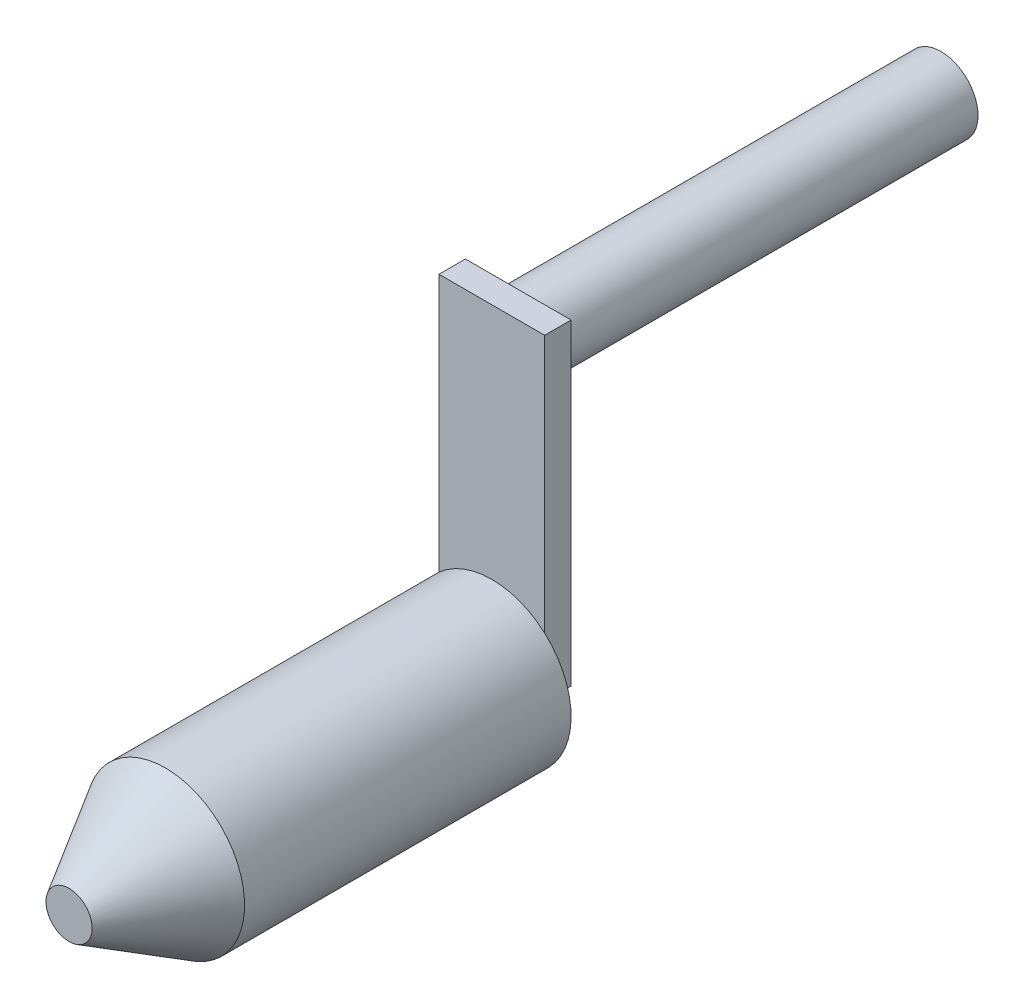
ISO-10303-21;
HEADER;
FILE_DESCRIPTION(('STEP AP214'),'2;1');
FILE_NAME('part.step','',(''),(''),'','','');
FILE_SCHEMA(('AUTOMOTIVE_DESIGN { 1 0 10303 214 1 1 1 1 }'));
ENDSEC;
DATA;
#1=APPLICATION_CONTEXT('core data for automotive mechanical design processes');
#2=APPLICATION_PROTOCOL_DEFINITION('international standard','automotive_design',2000,#1);
#3=PRODUCT_CONTEXT('',#1,'mechanical');
#4=PRODUCT('Part','Part','',(#3));
#5=PRODUCT_RELATED_PRODUCT_CATEGORY('part','',(#4));
#6=PRODUCT_DEFINITION_FORMATION('','',#4);
#7=PRODUCT_DEFINITION_CONTEXT('part definition',#1,'design');
#8=PRODUCT_DEFINITION('design','',#6,#7);
#9=PRODUCT_DEFINITION_SHAPE('','',#8);
#10=(LENGTH_UNIT() NAMED_UNIT(*) SI_UNIT(.MILLI.,.METRE.));
#11=(NAMED_UNIT(*) PLANE_ANGLE_UNIT() SI_UNIT($,.RADIAN.));
#12=(NAMED_UNIT(*) SI_UNIT($,.STERADIAN.) SOLID_ANGLE_UNIT());
#13=UNCERTAINTY_MEASURE_WITH_UNIT(LENGTH_MEASURE(1.E-05),#10,'distance_accuracy_value','');
#14=(GEOMETRIC_REPRESENTATION_CONTEXT(3) GLOBAL_UNCERTAINTY_ASSIGNED_CONTEXT((#13)) GLOBAL_UNIT_ASSIGNED_CONTEXT((#10,
#11,#12)) REPRESENTATION_CONTEXT('',''));
#15=CARTESIAN_POINT('',(0.,0.,0.));
#16=DIRECTION('',(0.,0.,1.));
#17=DIRECTION('',(1.,0.,0.));
#18=AXIS2_PLACEMENT_3D('',#15,#16,#17);
#19=CARTESIAN_POINT('',(0.,0.,0.));
#20=DIRECTION('',(0.,0.,1.));
#21=DIRECTION('',(1.,0.,0.));
#22=AXIS2_PLACEMENT_3D('',#19,#20,#21);
#23=PLANE('',#22);
#24=DIRECTION('',(0.,1.,0.));
#25=VECTOR('',#24,1.);
#26=CARTESIAN_POINT('',(-6.35,0.,0.));
#27=LINE('',#26,#25);
#28=CARTESIAN_POINT('',(-6.35,0.,0.));
#29=VERTEX_POINT('',#28);
#30=CARTESIAN_POINT('',(-6.35,7.09951582856183,0.));
#31=VERTEX_POINT('',#30);
#32=EDGE_CURVE('E49',#29,#31,#27,.T.);
#33=ORIENTED_EDGE('',*,*,#32,.F.);
#34=DIRECTION('',(-1.,0.,0.));
#35=VECTOR('',#34,1.);
#36=CARTESIAN_POINT('',(6.35,0.,0.));
#37=LINE('',#36,#35);
#38=CARTESIAN_POINT('',(6.35,0.,0.));
#39=VERTEX_POINT('',#38);
#40=EDGE_CURVE('E99',#39,#29,#37,.T.);
#41=ORIENTED_EDGE('',*,*,#40,.F.);
#42=DIRECTION('',(0.,-1.,0.));
#43=VECTOR('',#42,1.);
#44=CARTESIAN_POINT('',(6.35,0.,0.));
#45=LINE('',#44,#43);
#46=CARTESIAN_POINT('',(6.35,7.09951582856183,0.));
#47=VERTEX_POINT('',#46);
#48=EDGE_CURVE('E42',#47,#39,#45,.T.);
#49=ORIENTED_EDGE('',*,*,#48,.F.);
#50=CARTESIAN_POINT('',(0.,0.,0.));
#51=DIRECTION('',(0.,0.,1.));
#52=DIRECTION('',(1.,0.,0.));
#53=AXIS2_PLACEMENT_3D('',#50,#51,#52);
#54=CIRCLE('',#53,9.525);
#55=EDGE_CURVE('E54',#31,#47,#54,.T.);
#56=ORIENTED_EDGE('',*,*,#55,.F.);
#57=EDGE_LOOP('',(#33,#41,#49,#56));
#58=FACE_BOUND('',#57,.T.);
#59=ADVANCED_FACE('F34',(#58),#23,.F.);
#60=CARTESIAN_POINT('',(0.,0.,50.8));
#61=DIRECTION('',(0.,0.,-1.));
#62=DIRECTION('',(-1.,0.,0.));
#63=AXIS2_PLACEMENT_3D('',#60,#61,#62);
#64=CYLINDRICAL_SURFACE('',#63,9.525);
#65=CARTESIAN_POINT('',(0.,0.,39.2321334462176));
#66=DIRECTION('',(0.,0.,-1.));
#67=DIRECTION('',(-1.,0.,0.));
#68=AXIS2_PLACEMENT_3D('',#65,#66,#67);
#69=CIRCLE('',#68,9.525);
#70=CARTESIAN_POINT('',(-9.525,0.,39.2321334462176));
#71=VERTEX_POINT('',#70);
#72=EDGE_CURVE('E131',#71,#71,#69,.T.);
#73=ORIENTED_EDGE('',*,*,#72,.T.);
#74=EDGE_LOOP('',(#73));
#75=FACE_BOUND('',#74,.T.);
#76=EDGE_CURVE('E106',#47,#31,#54,.T.);
#77=ORIENTED_EDGE('',*,*,#76,.T.);
#78=ORIENTED_EDGE('',*,*,#55,.T.);
#79=EDGE_LOOP('',(#77,#78));
#80=FACE_BOUND('',#79,.T.);
#81=ADVANCED_FACE('F36',(#75,#80),#64,.T.);
#82=CARTESIAN_POINT('',(0.,0.,0.));
#83=DIRECTION('',(0.,0.,1.));
#84=DIRECTION('',(1.,0.,0.));
#85=AXIS2_PLACEMENT_3D('',#82,#83,#84);
#86=PLANE('',#85);
#87=ORIENTED_EDGE('',*,*,#76,.F.);
#88=CARTESIAN_POINT('',(6.35,38.1,0.));
#89=VERTEX_POINT('',#88);
#90=EDGE_CURVE('E114',#89,#47,#45,.T.);
#91=ORIENTED_EDGE('',*,*,#90,.F.);
#92=DIRECTION('',(1.,0.,0.));
#93=VECTOR('',#92,1.);
#94=CARTESIAN_POINT('',(6.35,38.1,0.));
#95=LINE('',#94,#93);
#96=CARTESIAN_POINT('',(-6.35,38.1,0.));
#97=VERTEX_POINT('',#96);
#98=EDGE_CURVE('E121',#97,#89,#95,.T.);
#99=ORIENTED_EDGE('',*,*,#98,.F.);
#100=EDGE_CURVE('E103',#31,#97,#27,.T.);
#101=ORIENTED_EDGE('',*,*,#100,.F.);
#102=EDGE_LOOP('',(#87,#91,#99,#101));
#103=FACE_BOUND('',#102,.T.);
#104=ADVANCED_FACE('F154',(#103),#86,.T.);
#105=CARTESIAN_POINT('',(-6.35,0.,-3.175));
#106=DIRECTION('',(1.,0.,0.));
#107=DIRECTION('',(0.,0.,-1.));
#108=AXIS2_PLACEMENT_3D('',#105,#106,#107);
#109=PLANE('',#108);
#110=ORIENTED_EDGE('',*,*,#32,.T.);
#111=ORIENTED_EDGE('',*,*,#100,.T.);
#112=DIRECTION('',(0.,0.,1.));
#113=VECTOR('',#112,1.);
#114=CARTESIAN_POINT('',(-6.35,38.1,-3.175));
#115=LINE('',#114,#113);
#116=CARTESIAN_POINT('',(-6.35,38.1,-3.175));
#117=VERTEX_POINT('',#116);
#118=EDGE_CURVE('E84',#117,#97,#115,.T.);
#119=ORIENTED_EDGE('',*,*,#118,.F.);
#120=DIRECTION('',(0.,1.,0.));
#121=VECTOR('',#120,1.);
#122=CARTESIAN_POINT('',(-6.35,0.,-3.175));
#123=LINE('',#122,#121);
#124=CARTESIAN_POINT('',(-6.35,0.,-3.175));
#125=VERTEX_POINT('',#124);
#126=EDGE_CURVE('E90',#125,#117,#123,.T.);
#127=ORIENTED_EDGE('',*,*,#126,.F.);
#128=DIRECTION('',(0.,0.,1.));
#129=VECTOR('',#128,1.);
#130=CARTESIAN_POINT('',(-6.35,0.,-3.175));
#131=LINE('',#130,#129);
#132=EDGE_CURVE('E126',#125,#29,#131,.T.);
#133=ORIENTED_EDGE('',*,*,#132,.T.);
#134=EDGE_LOOP('',(#110,#111,#119,#127,#133));
#135=FACE_BOUND('',#134,.T.);
#136=ADVANCED_FACE('F101',(#135),#109,.F.);
#137=CARTESIAN_POINT('',(6.35,38.1,-3.175));
#138=DIRECTION('',(0.,-1.,0.));
#139=DIRECTION('',(0.,0.,-1.));
#140=AXIS2_PLACEMENT_3D('',#137,#138,#139);
#141=PLANE('',#140);
#142=ORIENTED_EDGE('',*,*,#98,.T.);
#143=DIRECTION('',(0.,0.,1.));
#144=VECTOR('',#143,1.);
#145=CARTESIAN_POINT('',(6.35,38.1,-3.175));
#146=LINE('',#145,#144);
#147=CARTESIAN_POINT('',(6.35,38.1,-3.175));
#148=VERTEX_POINT('',#147);
#149=EDGE_CURVE('E86',#148,#89,#146,.T.);
#150=ORIENTED_EDGE('',*,*,#149,.F.);
#151=DIRECTION('',(1.,0.,0.));
#152=VECTOR('',#151,1.);
#153=CARTESIAN_POINT('',(6.35,38.1,-3.175));
#154=LINE('',#153,#152);
#155=EDGE_CURVE('E80',#117,#148,#154,.T.);
#156=ORIENTED_EDGE('',*,*,#155,.F.);
#157=ORIENTED_EDGE('',*,*,#118,.T.);
#158=EDGE_LOOP('',(#142,#150,#156,#157));
#159=FACE_BOUND('',#158,.T.);
#160=ADVANCED_FACE('F82',(#159),#141,.F.);
#161=CARTESIAN_POINT('',(6.35,0.,-3.175));
#162=DIRECTION('',(-1.,0.,0.));
#163=DIRECTION('',(0.,0.,1.));
#164=AXIS2_PLACEMENT_3D('',#161,#162,#163);
#165=PLANE('',#164);
#166=ORIENTED_EDGE('',*,*,#90,.T.);
#167=ORIENTED_EDGE('',*,*,#48,.T.);
#168=DIRECTION('',(0.,0.,1.));
#169=VECTOR('',#168,1.);
#170=CARTESIAN_POINT('',(6.35,0.,-3.175));
#171=LINE('',#170,#169);
#172=CARTESIAN_POINT('',(6.35,0.,-3.175));
#173=VERTEX_POINT('',#172);
#174=EDGE_CURVE('E107',#173,#39,#171,.T.);
#175=ORIENTED_EDGE('',*,*,#174,.F.);
#176=DIRECTION('',(0.,-1.,0.));
#177=VECTOR('',#176,1.);
#178=CARTESIAN_POINT('',(6.35,0.,-3.175));
#179=LINE('',#178,#177);
#180=EDGE_CURVE('E89',#148,#173,#179,.T.);
#181=ORIENTED_EDGE('',*,*,#180,.F.);
#182=ORIENTED_EDGE('',*,*,#149,.T.);
#183=EDGE_LOOP('',(#166,#167,#175,#181,#182));
#184=FACE_BOUND('',#183,.T.);
#185=ADVANCED_FACE('F171',(#184),#165,.F.);
#186=CARTESIAN_POINT('',(6.35,0.,-3.175));
#187=DIRECTION('',(0.,1.,0.));
#188=DIRECTION('',(0.,0.,1.));
#189=AXIS2_PLACEMENT_3D('',#186,#187,#188);
#190=PLANE('',#189);
#191=ORIENTED_EDGE('',*,*,#40,.T.);
#192=ORIENTED_EDGE('',*,*,#132,.F.);
#193=DIRECTION('',(-1.,0.,0.));
#194=VECTOR('',#193,1.);
#195=CARTESIAN_POINT('',(6.35,0.,-3.175));
#196=LINE('',#195,#194);
#197=EDGE_CURVE('E95',#173,#125,#196,.T.);
#198=ORIENTED_EDGE('',*,*,#197,.F.);
#199=ORIENTED_EDGE('',*,*,#174,.T.);
#200=EDGE_LOOP('',(#191,#192,#198,#199));
#201=FACE_BOUND('',#200,.T.);
#202=ADVANCED_FACE('F168',(#201),#190,.F.);
#203=CARTESIAN_POINT('',(0.,0.,-3.175));
#204=DIRECTION('',(0.,0.,1.));
#205=DIRECTION('',(1.,0.,0.));
#206=AXIS2_PLACEMENT_3D('',#203,#204,#205);
#207=PLANE('',#206);
#208=CARTESIAN_POINT('',(0.,33.02,-3.175));
#209=DIRECTION('',(0.,0.,1.));
#210=DIRECTION('',(1.,0.,0.));
#211=AXIS2_PLACEMENT_3D('',#208,#209,#210);
#212=CIRCLE('',#211,4.445);
#213=CARTESIAN_POINT('',(4.445,33.02,-3.175));
#214=VERTEX_POINT('',#213);
#215=EDGE_CURVE('E11',#214,#214,#212,.F.);
#216=ORIENTED_EDGE('',*,*,#215,.F.);
#217=EDGE_LOOP('',(#216));
#218=FACE_BOUND('',#217,.T.);
#219=ORIENTED_EDGE('',*,*,#126,.T.);
#220=ORIENTED_EDGE('',*,*,#155,.T.);
#221=ORIENTED_EDGE('',*,*,#180,.T.);
#222=ORIENTED_EDGE('',*,*,#197,.T.);
#223=EDGE_LOOP('',(#219,#220,#221,#222));
#224=FACE_BOUND('',#223,.T.);
#225=ADVANCED_FACE('F93',(#218,#224),#207,.F.);
#226=CARTESIAN_POINT('',(0.,33.02,-53.975));
#227=DIRECTION('',(0.,0.,1.));
#228=DIRECTION('',(1.,0.,0.));
#229=AXIS2_PLACEMENT_3D('',#226,#227,#228);
#230=CYLINDRICAL_SURFACE('',#229,4.445);
#231=CARTESIAN_POINT('',(0.,33.02,-53.975));
#232=DIRECTION('',(0.,0.,-1.));
#233=DIRECTION('',(-1.,0.,0.));
#234=AXIS2_PLACEMENT_3D('',#231,#232,#233);
#235=CIRCLE('',#234,4.445);
#236=CARTESIAN_POINT('',(-4.445,33.02,-53.975));
#237=VERTEX_POINT('',#236);
#238=EDGE_CURVE('E128',#237,#237,#235,.T.);
#239=ORIENTED_EDGE('',*,*,#238,.F.);
#240=EDGE_LOOP('',(#239));
#241=FACE_BOUND('',#240,.T.);
#242=ORIENTED_EDGE('',*,*,#215,.T.);
#243=EDGE_LOOP('',(#242));
#244=FACE_BOUND('',#243,.T.);
#245=ADVANCED_FACE('F194',(#241,#244),#230,.T.);
#246=CARTESIAN_POINT('',(0.,33.02,-53.975));
#247=DIRECTION('',(0.,0.,-1.));
#248=DIRECTION('',(-1.,0.,0.));
#249=AXIS2_PLACEMENT_3D('',#246,#247,#248);
#250=PLANE('',#249);
#251=ORIENTED_EDGE('',*,*,#238,.T.);
#252=EDGE_LOOP('',(#251));
#253=FACE_BOUND('',#252,.T.);
#254=ADVANCED_FACE('F146',(#253),#250,.T.);
#255=CARTESIAN_POINT('',(0.,0.,50.8));
#256=DIRECTION('',(0.,0.,-1.));
#257=DIRECTION('',(-1.,0.,0.));
#258=AXIS2_PLACEMENT_3D('',#255,#256,#257);
#259=CONICAL_SURFACE('',#258,2.77134642997771,0.528444038250657);
#260=CARTESIAN_POINT('',(0.,0.,50.8));
#261=DIRECTION('',(0.,0.,-1.));
#262=DIRECTION('',(-1.,0.,0.));
#263=AXIS2_PLACEMENT_3D('',#260,#261,#262);
#264=CIRCLE('',#263,2.77134642997771);
#265=CARTESIAN_POINT('',(-2.77134642997771,0.,50.8));
#266=VERTEX_POINT('',#265);
#267=EDGE_CURVE('E134',#266,#266,#264,.T.);
#268=CARTESIAN_POINT('',(-9.525,0.,39.2321334462176));
#269=CARTESIAN_POINT('',(-9.45464944197893,0.,39.3526320561529));
#270=CARTESIAN_POINT('',(-9.38429888395787,0.,39.4731306660881));
#271=CARTESIAN_POINT('',(-9.24359776791574,0.,39.7141278859586));
#272=CARTESIAN_POINT('',(-9.17324720989467,0.,39.8346264958938));
#273=CARTESIAN_POINT('',(-9.03254609385254,0.,40.0756237157643));
#274=CARTESIAN_POINT('',(-8.96219553583147,0.,40.1961223256995));
#275=CARTESIAN_POINT('',(-8.82149441978934,0.,40.43711954557));
#276=CARTESIAN_POINT('',(-8.75114386176828,0.,40.5576181555052));
#277=CARTESIAN_POINT('',(-8.61044274572615,0.,40.7986153753757));
#278=CARTESIAN_POINT('',(-8.54009218770508,0.,40.9191139853109));
#279=CARTESIAN_POINT('',(-8.39939107166295,0.,41.1601112051814));
#280=CARTESIAN_POINT('',(-8.32904051364188,0.,41.2806098151166));
#281=CARTESIAN_POINT('',(-8.18833939759975,0.,41.5216070349871));
#282=CARTESIAN_POINT('',(-8.11798883957869,0.,41.6421056449223));
#283=CARTESIAN_POINT('',(-7.97728772353656,0.,41.8831028647928));
#284=CARTESIAN_POINT('',(-7.90693716551549,0.,42.003601474728));
#285=CARTESIAN_POINT('',(-7.76623604947336,0.,42.2445986945985));
#286=CARTESIAN_POINT('',(-7.6958854914523,0.,42.3650973045337));
#287=CARTESIAN_POINT('',(-7.55518437541016,0.,42.6060945244042));
#288=CARTESIAN_POINT('',(-7.4848338173891,0.,42.7265931343394));
#289=CARTESIAN_POINT('',(-7.34413270134697,0.,42.9675903542099));
#290=CARTESIAN_POINT('',(-7.2737821433259,0.,43.0880889641451));
#291=CARTESIAN_POINT('',(-7.13308102728377,0.,43.3290861840156));
#292=CARTESIAN_POINT('',(-7.0627304692627,0.,43.4495847939508));
#293=CARTESIAN_POINT('',(-6.92202935322057,0.,43.6905820138213));
#294=CARTESIAN_POINT('',(-6.85167879519951,0.,43.8110806237565));
#295=CARTESIAN_POINT('',(-6.71097767915738,0.,44.052077843627));
#296=CARTESIAN_POINT('',(-6.64062712113631,0.,44.1725764535622));
#297=CARTESIAN_POINT('',(-6.49992600509418,0.,44.4135736734327));
#298=CARTESIAN_POINT('',(-6.42957544707312,0.,44.5340722833679));
#299=CARTESIAN_POINT('',(-6.28887433103098,0.,44.7750695032384));
#300=CARTESIAN_POINT('',(-6.21852377300992,0.,44.8955681131736));
#301=CARTESIAN_POINT('',(-6.07782265696779,0.,45.136565333044));
#302=CARTESIAN_POINT('',(-6.00747209894672,0.,45.2570639429793));
#303=CARTESIAN_POINT('',(-5.86677098290459,0.,45.4980611628497));
#304=CARTESIAN_POINT('',(-5.79642042488353,0.,45.618559772785));
#305=CARTESIAN_POINT('',(-5.65571930884139,0.,45.8595569926554));
#306=CARTESIAN_POINT('',(-5.58536875082033,0.,45.9800556025907));
#307=CARTESIAN_POINT('',(-5.4446676347782,0.,46.2210528224611));
#308=CARTESIAN_POINT('',(-5.37431707675713,0.,46.3415514323964));
#309=CARTESIAN_POINT('',(-5.233615960715,0.,46.5825486522668));
#310=CARTESIAN_POINT('',(-5.16326540269394,0.,46.7030472622021));
#311=CARTESIAN_POINT('',(-5.0225642866518,0.,46.9440444820725));
#312=CARTESIAN_POINT('',(-4.95221372863074,0.,47.0645430920078));
#313=CARTESIAN_POINT('',(-4.81151261258861,0.,47.3055403118782));
#314=CARTESIAN_POINT('',(-4.74116205456754,0.,47.4260389218135));
#315=CARTESIAN_POINT('',(-4.60046093852541,0.,47.6670361416839));
#316=CARTESIAN_POINT('',(-4.53011038050435,0.,47.7875347516192));
#317=CARTESIAN_POINT('',(-4.38940926446221,0.,48.0285319714896));
#318=CARTESIAN_POINT('',(-4.31905870644115,0.,48.1490305814249));
#319=CARTESIAN_POINT('',(-4.17835759039902,0.,48.3900278012953));
#320=CARTESIAN_POINT('',(-4.10800703237795,0.,48.5105264112306));
#321=CARTESIAN_POINT('',(-3.96730591633582,0.,48.751523631101));
#322=CARTESIAN_POINT('',(-3.89695535831476,0.,48.8720222410363));
#323=CARTESIAN_POINT('',(-3.75625424227263,0.,49.1130194609067));
#324=CARTESIAN_POINT('',(-3.68590368425156,0.,49.233518070842));
#325=CARTESIAN_POINT('',(-3.54520256820943,0.,49.4745152907124));
#326=CARTESIAN_POINT('',(-3.47485201018836,0.,49.5950139006477));
#327=CARTESIAN_POINT('',(-3.33415089414623,0.,49.8360111205181));
#328=CARTESIAN_POINT('',(-3.26380033612517,0.,49.9565097304534));
#329=CARTESIAN_POINT('',(-3.12309922008303,0.,50.1975069503238));
#330=CARTESIAN_POINT('',(-3.05274866206197,0.,50.3180055602591));
#331=CARTESIAN_POINT('',(-2.91204754601984,0.,50.5590027801295));
#332=CARTESIAN_POINT('',(-2.84169698799877,0.,50.6795013900648));
#333=CARTESIAN_POINT('',(-2.77134642997771,0.,50.8));
#334=B_SPLINE_CURVE_WITH_KNOTS('',3,(#268,#269,#270,#271,#272,#273,#274,#275,#276,#277,#278,
#279,#280,#281,#282,#283,#284,#285,#286,#287,#288,#289,#290,#291,#292,#293,#294,#295,#296,#297,
#298,#299,#300,#301,#302,#303,#304,#305,#306,#307,#308,#309,#310,#311,#312,#313,#314,#315,#316,
#317,#318,#319,#320,#321,#322,#323,#324,#325,#326,#327,#328,#329,#330,#331,#332,#333),
.UNSPECIFIED.,.F.,.F.,(4,2,2,2,2,2,2,2,2,2,2,2,2,2,2,2,2,2,2,2,2,2,2,2,2,2,2,2,2,2,2,2,4),(0.,
0.41859532258709,0.837190645174178,1.25578596776127,1.67438129034836,2.09297661293545,
2.51157193552253,2.93016725810962,3.34876258069671,3.7673579032838,4.18595322587089,
4.60454854845798,5.02314387104506,5.44173919363215,5.86033451621924,6.27892983880633,
6.69752516139341,7.1161204839805,7.53471580656759,7.95331112915468,8.37190645174177,
8.79050177432886,9.20909709691595,9.62769241950304,10.0462877420901,10.4648830646772,
10.8834783872643,11.3020737098514,11.7206690324385,12.1392643550256,12.5578596776127,
12.9764550001997,13.3950503227868),.UNSPECIFIED.);
#335=EDGE_CURVE('BSEAM138',#71,#266,#334,.T.);
#336=ORIENTED_EDGE('',*,*,#72,.F.);
#337=ORIENTED_EDGE('',*,*,#267,.T.);
#338=ORIENTED_EDGE('',*,*,#335,.T.);
#339=ORIENTED_EDGE('',*,*,#335,.F.);
#340=EDGE_LOOP('',(#336,#338,#337,#339));
#341=FACE_BOUND('',#340,.T.);
#342=ADVANCED_FACE('F138',(#341),#259,.T.);
#343=CARTESIAN_POINT('',(0.,0.,50.8));
#344=DIRECTION('',(0.,0.,1.));
#345=DIRECTION('',(1.,0.,0.));
#346=AXIS2_PLACEMENT_3D('',#343,#344,#345);
#347=PLANE('',#346);
#348=ORIENTED_EDGE('',*,*,#267,.F.);
#349=EDGE_LOOP('',(#348));
#350=FACE_BOUND('',#349,.T.);
#351=ADVANCED_FACE('F140',(#350),#347,.T.);
#352=CLOSED_SHELL('',(#59,#81,#104,#136,#160,#185,#202,#225,#245,#254,#342,#351));
#353=MANIFOLD_SOLID_BREP('B2',#352);
#354=ADVANCED_BREP_SHAPE_REPRESENTATION('',(#18,#353),#14);
#355=SHAPE_DEFINITION_REPRESENTATION(#9,#354);
ENDSEC;
END-ISO-10303-21;
